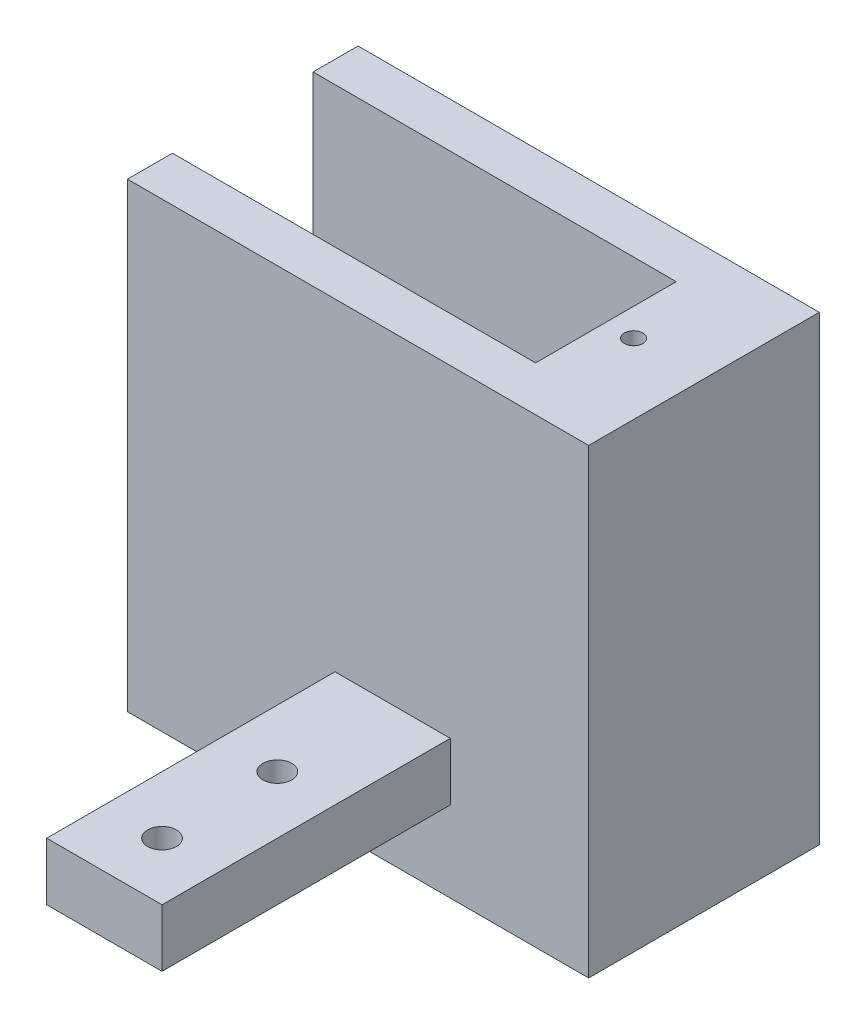
ISO-10303-21;
HEADER;
FILE_DESCRIPTION(('STEP AP214'),'2;1');
FILE_NAME('part.step','',(''),(''),'','','');
FILE_SCHEMA(('AUTOMOTIVE_DESIGN { 1 0 10303 214 1 1 1 1 }'));
ENDSEC;
DATA;
#1=APPLICATION_CONTEXT('core data for automotive mechanical design processes');
#2=APPLICATION_PROTOCOL_DEFINITION('international standard','automotive_design',2000,#1);
#3=PRODUCT_CONTEXT('',#1,'mechanical');
#4=PRODUCT('Part','Part','',(#3));
#5=PRODUCT_RELATED_PRODUCT_CATEGORY('part','',(#4));
#6=PRODUCT_DEFINITION_FORMATION('','',#4);
#7=PRODUCT_DEFINITION_CONTEXT('part definition',#1,'design');
#8=PRODUCT_DEFINITION('design','',#6,#7);
#9=PRODUCT_DEFINITION_SHAPE('','',#8);
#10=(LENGTH_UNIT() NAMED_UNIT(*) SI_UNIT(.MILLI.,.METRE.));
#11=(NAMED_UNIT(*) PLANE_ANGLE_UNIT() SI_UNIT($,.RADIAN.));
#12=(NAMED_UNIT(*) SI_UNIT($,.STERADIAN.) SOLID_ANGLE_UNIT());
#13=UNCERTAINTY_MEASURE_WITH_UNIT(LENGTH_MEASURE(1.E-05),#10,'distance_accuracy_value','');
#14=(GEOMETRIC_REPRESENTATION_CONTEXT(3) GLOBAL_UNCERTAINTY_ASSIGNED_CONTEXT((#13)) GLOBAL_UNIT_ASSIGNED_CONTEXT((#10,
#11,#12)) REPRESENTATION_CONTEXT('',''));
#15=CARTESIAN_POINT('',(0.,0.,0.));
#16=DIRECTION('',(0.,0.,1.));
#17=DIRECTION('',(1.,0.,0.));
#18=AXIS2_PLACEMENT_3D('',#15,#16,#17);
#19=CARTESIAN_POINT('',(0.,0.,10.));
#20=DIRECTION('',(0.,0.,1.));
#21=DIRECTION('',(1.,0.,0.));
#22=AXIS2_PLACEMENT_3D('',#19,#20,#21);
#23=PLANE('',#22);
#24=DIRECTION('',(0.,1.,0.));
#25=VECTOR('',#24,1.);
#26=CARTESIAN_POINT('',(20.,20.,10.));
#27=LINE('',#26,#25);
#28=CARTESIAN_POINT('',(20.,-20.,10.));
#29=VERTEX_POINT('',#28);
#30=CARTESIAN_POINT('',(20.,20.,10.));
#31=VERTEX_POINT('',#30);
#32=EDGE_CURVE('E206',#29,#31,#27,.T.);
#33=ORIENTED_EDGE('',*,*,#32,.T.);
#34=DIRECTION('',(-1.,0.,0.));
#35=VECTOR('',#34,1.);
#36=CARTESIAN_POINT('',(-20.,20.,10.));
#37=LINE('',#36,#35);
#38=CARTESIAN_POINT('',(-20.,20.,10.));
#39=VERTEX_POINT('',#38);
#40=EDGE_CURVE('E208',#31,#39,#37,.T.);
#41=ORIENTED_EDGE('',*,*,#40,.T.);
#42=DIRECTION('',(0.,-1.,0.));
#43=VECTOR('',#42,1.);
#44=CARTESIAN_POINT('',(-20.,20.,10.));
#45=LINE('',#44,#43);
#46=CARTESIAN_POINT('',(-20.,-20.,10.));
#47=VERTEX_POINT('',#46);
#48=EDGE_CURVE('E210',#39,#47,#45,.T.);
#49=ORIENTED_EDGE('',*,*,#48,.T.);
#50=DIRECTION('',(1.,0.,0.));
#51=VECTOR('',#50,1.);
#52=CARTESIAN_POINT('',(-20.,-20.,10.));
#53=LINE('',#52,#51);
#54=EDGE_CURVE('E63',#47,#29,#53,.T.);
#55=ORIENTED_EDGE('',*,*,#54,.T.);
#56=EDGE_LOOP('',(#33,#41,#49,#55));
#57=FACE_BOUND('',#56,.T.);
#58=DIRECTION('',(-1.,0.,0.));
#59=VECTOR('',#58,1.);
#60=CARTESIAN_POINT('',(7.99999999999999,-8.,10.));
#61=LINE('',#60,#59);
#62=CARTESIAN_POINT('',(7.99999999999999,-8.,10.));
#63=VERTEX_POINT('',#62);
#64=CARTESIAN_POINT('',(-2.00000000000001,-8.00000000000001,10.));
#65=VERTEX_POINT('',#64);
#66=EDGE_CURVE('E524',#63,#65,#61,.T.);
#67=ORIENTED_EDGE('',*,*,#66,.F.);
#68=DIRECTION('',(0.,1.,0.));
#69=VECTOR('',#68,1.);
#70=CARTESIAN_POINT('',(7.99999999999999,-13.,10.));
#71=LINE('',#70,#69);
#72=CARTESIAN_POINT('',(7.99999999999999,-13.,10.));
#73=VERTEX_POINT('',#72);
#74=EDGE_CURVE('E156',#73,#63,#71,.T.);
#75=ORIENTED_EDGE('',*,*,#74,.F.);
#76=DIRECTION('',(1.,0.,0.));
#77=VECTOR('',#76,1.);
#78=CARTESIAN_POINT('',(-2.00000000000001,-13.,10.));
#79=LINE('',#78,#77);
#80=CARTESIAN_POINT('',(-2.00000000000001,-13.,10.));
#81=VERTEX_POINT('',#80);
#82=EDGE_CURVE('E152',#81,#73,#79,.T.);
#83=ORIENTED_EDGE('',*,*,#82,.F.);
#84=DIRECTION('',(0.,-1.,0.));
#85=VECTOR('',#84,1.);
#86=CARTESIAN_POINT('',(-2.00000000000001,-8.00000000000001,10.));
#87=LINE('',#86,#85);
#88=EDGE_CURVE('E526',#65,#81,#87,.T.);
#89=ORIENTED_EDGE('',*,*,#88,.F.);
#90=EDGE_LOOP('',(#67,#75,#83,#89));
#91=FACE_BOUND('',#90,.T.);
#92=ADVANCED_FACE('F40',(#57,#91),#23,.T.);
#93=CARTESIAN_POINT('',(-20.,20.,10.));
#94=DIRECTION('',(0.,-1.,0.));
#95=DIRECTION('',(0.,0.,-1.));
#96=AXIS2_PLACEMENT_3D('',#93,#94,#95);
#97=PLANE('',#96);
#98=CARTESIAN_POINT('',(13.9,20.,0.));
#99=DIRECTION('',(0.,1.,0.));
#100=DIRECTION('',(0.,0.,1.));
#101=AXIS2_PLACEMENT_3D('',#98,#99,#100);
#102=CIRCLE('',#101,0.79999999999999);
#103=CARTESIAN_POINT('',(13.9,20.,0.79999999999999));
#104=VERTEX_POINT('',#103);
#105=EDGE_CURVE('E158',#104,#104,#102,.T.);
#106=ORIENTED_EDGE('',*,*,#105,.F.);
#107=EDGE_LOOP('',(#106));
#108=FACE_BOUND('',#107,.T.);
#109=DIRECTION('',(1.,0.,0.));
#110=VECTOR('',#109,1.);
#111=CARTESIAN_POINT('',(-38.5,20.,-6.1));
#112=LINE('',#111,#110);
#113=CARTESIAN_POINT('',(-20.,20.,-6.1));
#114=VERTEX_POINT('',#113);
#115=CARTESIAN_POINT('',(11.5,20.,-6.1));
#116=VERTEX_POINT('',#115);
#117=EDGE_CURVE('E174',#114,#116,#112,.T.);
#118=ORIENTED_EDGE('',*,*,#117,.T.);
#119=DIRECTION('',(0.,0.,-1.));
#120=VECTOR('',#119,1.);
#121=CARTESIAN_POINT('',(11.5,20.,6.1));
#122=LINE('',#121,#120);
#123=CARTESIAN_POINT('',(11.5,20.,6.1));
#124=VERTEX_POINT('',#123);
#125=EDGE_CURVE('E200',#124,#116,#122,.T.);
#126=ORIENTED_EDGE('',*,*,#125,.F.);
#127=DIRECTION('',(1.,0.,0.));
#128=VECTOR('',#127,1.);
#129=CARTESIAN_POINT('',(-38.5,20.,6.1));
#130=LINE('',#129,#128);
#131=CARTESIAN_POINT('',(-20.,20.,6.1));
#132=VERTEX_POINT('',#131);
#133=EDGE_CURVE('E192',#132,#124,#130,.T.);
#134=ORIENTED_EDGE('',*,*,#133,.F.);
#135=DIRECTION('',(0.,0.,-1.));
#136=VECTOR('',#135,1.);
#137=CARTESIAN_POINT('',(-20.,20.,10.));
#138=LINE('',#137,#136);
#139=EDGE_CURVE('E217',#39,#132,#138,.T.);
#140=ORIENTED_EDGE('',*,*,#139,.F.);
#141=ORIENTED_EDGE('',*,*,#40,.F.);
#142=DIRECTION('',(0.,0.,-1.));
#143=VECTOR('',#142,1.);
#144=CARTESIAN_POINT('',(20.,20.,10.));
#145=LINE('',#144,#143);
#146=CARTESIAN_POINT('',(20.,20.,-10.));
#147=VERTEX_POINT('',#146);
#148=EDGE_CURVE('E220',#31,#147,#145,.T.);
#149=ORIENTED_EDGE('',*,*,#148,.T.);
#150=DIRECTION('',(-1.,0.,0.));
#151=VECTOR('',#150,1.);
#152=CARTESIAN_POINT('',(-20.,20.,-10.));
#153=LINE('',#152,#151);
#154=CARTESIAN_POINT('',(-20.,20.,-10.));
#155=VERTEX_POINT('',#154);
#156=EDGE_CURVE('E186',#147,#155,#153,.T.);
#157=ORIENTED_EDGE('',*,*,#156,.T.);
#158=DIRECTION('',(0.,0.,1.));
#159=VECTOR('',#158,1.);
#160=CARTESIAN_POINT('',(-20.,20.,-10.));
#161=LINE('',#160,#159);
#162=EDGE_CURVE('E189',#155,#114,#161,.T.);
#163=ORIENTED_EDGE('',*,*,#162,.T.);
#164=EDGE_LOOP('',(#118,#126,#134,#140,#141,#149,#157,#163));
#165=FACE_BOUND('',#164,.T.);
#166=ADVANCED_FACE('F231',(#108,#165),#97,.F.);
#167=CARTESIAN_POINT('',(-20.,20.,10.));
#168=DIRECTION('',(1.,0.,0.));
#169=DIRECTION('',(0.,1.,0.));
#170=AXIS2_PLACEMENT_3D('',#167,#168,#169);
#171=PLANE('',#170);
#172=DIRECTION('',(0.,0.,-1.));
#173=VECTOR('',#172,1.);
#174=CARTESIAN_POINT('',(-20.,3.99999999999999,10.));
#175=LINE('',#174,#173);
#176=CARTESIAN_POINT('',(-20.,3.99999999999999,6.1));
#177=VERTEX_POINT('',#176);
#178=CARTESIAN_POINT('',(-20.,3.99999999999999,-6.1));
#179=VERTEX_POINT('',#178);
#180=EDGE_CURVE('E203',#177,#179,#175,.T.);
#181=ORIENTED_EDGE('',*,*,#180,.T.);
#182=DIRECTION('',(0.,-1.,0.));
#183=VECTOR('',#182,1.);
#184=CARTESIAN_POINT('',(-20.,20.,-6.1));
#185=LINE('',#184,#183);
#186=EDGE_CURVE('E11',#114,#179,#185,.T.);
#187=ORIENTED_EDGE('',*,*,#186,.F.);
#188=ORIENTED_EDGE('',*,*,#162,.F.);
#189=DIRECTION('',(0.,-1.,0.));
#190=VECTOR('',#189,1.);
#191=CARTESIAN_POINT('',(-20.,20.,-10.));
#192=LINE('',#191,#190);
#193=CARTESIAN_POINT('',(-20.,-20.,-10.));
#194=VERTEX_POINT('',#193);
#195=EDGE_CURVE('E183',#155,#194,#192,.T.);
#196=ORIENTED_EDGE('',*,*,#195,.T.);
#197=DIRECTION('',(0.,0.,-1.));
#198=VECTOR('',#197,1.);
#199=CARTESIAN_POINT('',(-20.,-20.,10.));
#200=LINE('',#199,#198);
#201=EDGE_CURVE('E215',#47,#194,#200,.T.);
#202=ORIENTED_EDGE('',*,*,#201,.F.);
#203=ORIENTED_EDGE('',*,*,#48,.F.);
#204=ORIENTED_EDGE('',*,*,#139,.T.);
#205=DIRECTION('',(0.,1.,0.));
#206=VECTOR('',#205,1.);
#207=CARTESIAN_POINT('',(-20.,20.,6.1));
#208=LINE('',#207,#206);
#209=EDGE_CURVE('E48',#177,#132,#208,.T.);
#210=ORIENTED_EDGE('',*,*,#209,.F.);
#211=EDGE_LOOP('',(#181,#187,#188,#196,#202,#203,#204,#210));
#212=FACE_BOUND('',#211,.T.);
#213=ADVANCED_FACE('F233',(#212),#171,.F.);
#214=CARTESIAN_POINT('',(20.,20.,10.));
#215=DIRECTION('',(-1.,0.,0.));
#216=DIRECTION('',(0.,-1.,0.));
#217=AXIS2_PLACEMENT_3D('',#214,#215,#216);
#218=PLANE('',#217);
#219=DIRECTION('',(0.,1.,0.));
#220=VECTOR('',#219,1.);
#221=CARTESIAN_POINT('',(20.,20.,-10.));
#222=LINE('',#221,#220);
#223=CARTESIAN_POINT('',(20.,-20.,-10.));
#224=VERTEX_POINT('',#223);
#225=EDGE_CURVE('E177',#224,#147,#222,.T.);
#226=ORIENTED_EDGE('',*,*,#225,.T.);
#227=ORIENTED_EDGE('',*,*,#148,.F.);
#228=ORIENTED_EDGE('',*,*,#32,.F.);
#229=DIRECTION('',(0.,0.,-1.));
#230=VECTOR('',#229,1.);
#231=CARTESIAN_POINT('',(20.,-20.,10.));
#232=LINE('',#231,#230);
#233=EDGE_CURVE('E213',#29,#224,#232,.T.);
#234=ORIENTED_EDGE('',*,*,#233,.T.);
#235=EDGE_LOOP('',(#226,#227,#228,#234));
#236=FACE_BOUND('',#235,.T.);
#237=ADVANCED_FACE('F42',(#236),#218,.F.);
#238=CARTESIAN_POINT('',(-20.,-20.,10.));
#239=DIRECTION('',(0.,1.,0.));
#240=DIRECTION('',(0.,0.,1.));
#241=AXIS2_PLACEMENT_3D('',#238,#239,#240);
#242=PLANE('',#241);
#243=DIRECTION('',(1.,0.,0.));
#244=VECTOR('',#243,1.);
#245=CARTESIAN_POINT('',(-20.,-20.,-10.));
#246=LINE('',#245,#244);
#247=EDGE_CURVE('E180',#194,#224,#246,.T.);
#248=ORIENTED_EDGE('',*,*,#247,.T.);
#249=ORIENTED_EDGE('',*,*,#233,.F.);
#250=ORIENTED_EDGE('',*,*,#54,.F.);
#251=ORIENTED_EDGE('',*,*,#201,.T.);
#252=EDGE_LOOP('',(#248,#249,#250,#251));
#253=FACE_BOUND('',#252,.T.);
#254=ADVANCED_FACE('F261',(#253),#242,.F.);
#255=CARTESIAN_POINT('',(0.,0.,6.1));
#256=DIRECTION('',(0.,0.,-1.));
#257=DIRECTION('',(-1.,0.,0.));
#258=AXIS2_PLACEMENT_3D('',#255,#256,#257);
#259=PLANE('',#258);
#260=ORIENTED_EDGE('',*,*,#209,.T.);
#261=ORIENTED_EDGE('',*,*,#133,.T.);
#262=DIRECTION('',(0.,-1.,0.));
#263=VECTOR('',#262,1.);
#264=CARTESIAN_POINT('',(11.5,20.,6.1));
#265=LINE('',#264,#263);
#266=CARTESIAN_POINT('',(11.5,4.,6.1));
#267=VERTEX_POINT('',#266);
#268=EDGE_CURVE('E194',#124,#267,#265,.T.);
#269=ORIENTED_EDGE('',*,*,#268,.T.);
#270=DIRECTION('',(-1.,0.,0.));
#271=VECTOR('',#270,1.);
#272=CARTESIAN_POINT('',(11.5,4.,6.1));
#273=LINE('',#272,#271);
#274=EDGE_CURVE('E197',#267,#177,#273,.T.);
#275=ORIENTED_EDGE('',*,*,#274,.T.);
#276=EDGE_LOOP('',(#260,#261,#269,#275));
#277=FACE_BOUND('',#276,.T.);
#278=ADVANCED_FACE('F224',(#277),#259,.T.);
#279=CARTESIAN_POINT('',(11.5,4.,6.1));
#280=DIRECTION('',(0.,-1.,0.));
#281=DIRECTION('',(1.,0.,0.));
#282=AXIS2_PLACEMENT_3D('',#279,#280,#281);
#283=PLANE('',#282);
#284=DIRECTION('',(0.,0.,-1.));
#285=VECTOR('',#284,1.);
#286=CARTESIAN_POINT('',(11.5,4.,6.1));
#287=LINE('',#286,#285);
#288=CARTESIAN_POINT('',(11.5,4.,-6.1));
#289=VERTEX_POINT('',#288);
#290=EDGE_CURVE('E201',#267,#289,#287,.T.);
#291=ORIENTED_EDGE('',*,*,#290,.T.);
#292=DIRECTION('',(-1.,0.,0.));
#293=VECTOR('',#292,1.);
#294=CARTESIAN_POINT('',(11.5,4.,-6.1));
#295=LINE('',#294,#293);
#296=EDGE_CURVE('E168',#289,#179,#295,.T.);
#297=ORIENTED_EDGE('',*,*,#296,.T.);
#298=ORIENTED_EDGE('',*,*,#180,.F.);
#299=ORIENTED_EDGE('',*,*,#274,.F.);
#300=EDGE_LOOP('',(#291,#297,#298,#299));
#301=FACE_BOUND('',#300,.T.);
#302=ADVANCED_FACE('F253',(#301),#283,.F.);
#303=CARTESIAN_POINT('',(11.5,20.,6.1));
#304=DIRECTION('',(1.,0.,0.));
#305=DIRECTION('',(0.,1.,0.));
#306=AXIS2_PLACEMENT_3D('',#303,#304,#305);
#307=PLANE('',#306);
#308=ORIENTED_EDGE('',*,*,#125,.T.);
#309=DIRECTION('',(0.,-1.,0.));
#310=VECTOR('',#309,1.);
#311=CARTESIAN_POINT('',(11.5,20.,-6.1));
#312=LINE('',#311,#310);
#313=EDGE_CURVE('E171',#116,#289,#312,.T.);
#314=ORIENTED_EDGE('',*,*,#313,.T.);
#315=ORIENTED_EDGE('',*,*,#290,.F.);
#316=ORIENTED_EDGE('',*,*,#268,.F.);
#317=EDGE_LOOP('',(#308,#314,#315,#316));
#318=FACE_BOUND('',#317,.T.);
#319=ADVANCED_FACE('F251',(#318),#307,.F.);
#320=CARTESIAN_POINT('',(0.,0.,-10.));
#321=DIRECTION('',(0.,0.,-1.));
#322=DIRECTION('',(1.,0.,0.));
#323=AXIS2_PLACEMENT_3D('',#320,#321,#322);
#324=PLANE('',#323);
#325=ORIENTED_EDGE('',*,*,#225,.F.);
#326=ORIENTED_EDGE('',*,*,#247,.F.);
#327=ORIENTED_EDGE('',*,*,#195,.F.);
#328=ORIENTED_EDGE('',*,*,#156,.F.);
#329=EDGE_LOOP('',(#325,#326,#327,#328));
#330=FACE_BOUND('',#329,.T.);
#331=ADVANCED_FACE('F244',(#330),#324,.T.);
#332=CARTESIAN_POINT('',(0.,0.,-6.1));
#333=DIRECTION('',(0.,0.,1.));
#334=DIRECTION('',(-1.,0.,0.));
#335=AXIS2_PLACEMENT_3D('',#332,#333,#334);
#336=PLANE('',#335);
#337=ORIENTED_EDGE('',*,*,#186,.T.);
#338=ORIENTED_EDGE('',*,*,#296,.F.);
#339=ORIENTED_EDGE('',*,*,#313,.F.);
#340=ORIENTED_EDGE('',*,*,#117,.F.);
#341=EDGE_LOOP('',(#337,#338,#339,#340));
#342=FACE_BOUND('',#341,.T.);
#343=ADVANCED_FACE('F248',(#342),#336,.T.);
#344=CARTESIAN_POINT('',(13.9,10.,0.));
#345=DIRECTION('',(0.,1.,0.));
#346=DIRECTION('',(0.,0.,1.));
#347=AXIS2_PLACEMENT_3D('',#344,#345,#346);
#348=CONICAL_SURFACE('',#347,0.799999999999997,1.02974425867665);
#349=CARTESIAN_POINT('',(13.9,9.51931150477795,0.));
#350=VERTEX_POINT('',#349);
#351=VERTEX_LOOP('',#350);
#352=FACE_BOUND('',#351,.T.);
#353=CARTESIAN_POINT('',(13.9,10.,0.));
#354=DIRECTION('',(0.,1.,0.));
#355=DIRECTION('',(0.,0.,1.));
#356=AXIS2_PLACEMENT_3D('',#353,#354,#355);
#357=CIRCLE('',#356,0.799999999999997);
#358=CARTESIAN_POINT('',(13.9,10.,0.799999999999997));
#359=VERTEX_POINT('',#358);
#360=EDGE_CURVE('E161',#359,#359,#357,.T.);
#361=ORIENTED_EDGE('',*,*,#360,.T.);
#362=EDGE_LOOP('',(#361));
#363=FACE_BOUND('',#362,.T.);
#364=ADVANCED_FACE('F322',(#352,#363),#348,.F.);
#365=CARTESIAN_POINT('',(13.9,20.,0.));
#366=DIRECTION('',(0.,1.,0.));
#367=DIRECTION('',(0.,0.,1.));
#368=AXIS2_PLACEMENT_3D('',#365,#366,#367);
#369=CYLINDRICAL_SURFACE('',#368,0.799999999999993);
#370=ORIENTED_EDGE('',*,*,#360,.F.);
#371=EDGE_LOOP('',(#370));
#372=FACE_BOUND('',#371,.T.);
#373=ORIENTED_EDGE('',*,*,#105,.T.);
#374=EDGE_LOOP('',(#373));
#375=FACE_BOUND('',#374,.T.);
#376=ADVANCED_FACE('F331',(#372,#375),#369,.F.);
#377=CARTESIAN_POINT('',(7.99999999999999,-13.,35.));
#378=DIRECTION('',(-1.,0.,0.));
#379=DIRECTION('',(0.,0.,1.));
#380=AXIS2_PLACEMENT_3D('',#377,#378,#379);
#381=PLANE('',#380);
#382=ORIENTED_EDGE('',*,*,#74,.T.);
#383=DIRECTION('',(0.,0.,-1.));
#384=VECTOR('',#383,1.);
#385=CARTESIAN_POINT('',(7.99999999999999,-8.,35.));
#386=LINE('',#385,#384);
#387=CARTESIAN_POINT('',(7.99999999999999,-8.,35.));
#388=VERTEX_POINT('',#387);
#389=EDGE_CURVE('E137',#388,#63,#386,.T.);
#390=ORIENTED_EDGE('',*,*,#389,.F.);
#391=DIRECTION('',(0.,1.,0.));
#392=VECTOR('',#391,1.);
#393=CARTESIAN_POINT('',(7.99999999999999,-13.,35.));
#394=LINE('',#393,#392);
#395=CARTESIAN_POINT('',(7.99999999999999,-13.,35.));
#396=VERTEX_POINT('',#395);
#397=EDGE_CURVE('E144',#396,#388,#394,.T.);
#398=ORIENTED_EDGE('',*,*,#397,.F.);
#399=DIRECTION('',(0.,0.,-1.));
#400=VECTOR('',#399,1.);
#401=CARTESIAN_POINT('',(7.99999999999999,-13.,35.));
#402=LINE('',#401,#400);
#403=EDGE_CURVE('E522',#396,#73,#402,.T.);
#404=ORIENTED_EDGE('',*,*,#403,.T.);
#405=EDGE_LOOP('',(#382,#390,#398,#404));
#406=FACE_BOUND('',#405,.T.);
#407=ADVANCED_FACE('F154',(#406),#381,.F.);
#408=CARTESIAN_POINT('',(7.99999999999999,-8.,35.));
#409=DIRECTION('',(0.,-1.,0.));
#410=DIRECTION('',(1.,0.,0.));
#411=AXIS2_PLACEMENT_3D('',#408,#409,#410);
#412=PLANE('',#411);
#413=CARTESIAN_POINT('',(2.99999999999999,-8.,20.));
#414=DIRECTION('',(0.,-1.,0.));
#415=DIRECTION('',(1.,0.,0.));
#416=AXIS2_PLACEMENT_3D('',#413,#414,#415);
#417=CIRCLE('',#416,1.24999999999999);
#418=CARTESIAN_POINT('',(4.24999999999998,-8.,20.));
#419=VERTEX_POINT('',#418);
#420=EDGE_CURVE('E510',#419,#419,#417,.T.);
#421=ORIENTED_EDGE('',*,*,#420,.T.);
#422=EDGE_LOOP('',(#421));
#423=FACE_BOUND('',#422,.T.);
#424=CARTESIAN_POINT('',(2.99999999999999,-8.,30.));
#425=DIRECTION('',(0.,-1.,0.));
#426=DIRECTION('',(1.,0.,0.));
#427=AXIS2_PLACEMENT_3D('',#424,#425,#426);
#428=CIRCLE('',#427,1.24999999999999);
#429=CARTESIAN_POINT('',(4.24999999999998,-8.,30.));
#430=VERTEX_POINT('',#429);
#431=EDGE_CURVE('E514',#430,#430,#428,.T.);
#432=ORIENTED_EDGE('',*,*,#431,.T.);
#433=EDGE_LOOP('',(#432));
#434=FACE_BOUND('',#433,.T.);
#435=ORIENTED_EDGE('',*,*,#66,.T.);
#436=DIRECTION('',(0.,0.,-1.));
#437=VECTOR('',#436,1.);
#438=CARTESIAN_POINT('',(-2.00000000000001,-8.00000000000001,35.));
#439=LINE('',#438,#437);
#440=CARTESIAN_POINT('',(-2.00000000000001,-8.00000000000001,35.));
#441=VERTEX_POINT('',#440);
#442=EDGE_CURVE('E140',#441,#65,#439,.T.);
#443=ORIENTED_EDGE('',*,*,#442,.F.);
#444=DIRECTION('',(-1.,0.,0.));
#445=VECTOR('',#444,1.);
#446=CARTESIAN_POINT('',(7.99999999999999,-8.,35.));
#447=LINE('',#446,#445);
#448=EDGE_CURVE('E133',#388,#441,#447,.T.);
#449=ORIENTED_EDGE('',*,*,#448,.F.);
#450=ORIENTED_EDGE('',*,*,#389,.T.);
#451=EDGE_LOOP('',(#435,#443,#449,#450));
#452=FACE_BOUND('',#451,.T.);
#453=ADVANCED_FACE('F135',(#423,#434,#452),#412,.F.);
#454=CARTESIAN_POINT('',(-2.00000000000001,-8.00000000000001,35.));
#455=DIRECTION('',(1.,0.,0.));
#456=DIRECTION('',(0.,1.,0.));
#457=AXIS2_PLACEMENT_3D('',#454,#455,#456);
#458=PLANE('',#457);
#459=ORIENTED_EDGE('',*,*,#88,.T.);
#460=DIRECTION('',(0.,0.,-1.));
#461=VECTOR('',#460,1.);
#462=CARTESIAN_POINT('',(-2.00000000000001,-13.,35.));
#463=LINE('',#462,#461);
#464=CARTESIAN_POINT('',(-2.00000000000001,-13.,35.));
#465=VERTEX_POINT('',#464);
#466=EDGE_CURVE('E55',#465,#81,#463,.T.);
#467=ORIENTED_EDGE('',*,*,#466,.F.);
#468=DIRECTION('',(0.,-1.,0.));
#469=VECTOR('',#468,1.);
#470=CARTESIAN_POINT('',(-2.00000000000001,-8.00000000000001,35.));
#471=LINE('',#470,#469);
#472=EDGE_CURVE('E143',#441,#465,#471,.T.);
#473=ORIENTED_EDGE('',*,*,#472,.F.);
#474=ORIENTED_EDGE('',*,*,#442,.T.);
#475=EDGE_LOOP('',(#459,#467,#473,#474));
#476=FACE_BOUND('',#475,.T.);
#477=ADVANCED_FACE('F363',(#476),#458,.F.);
#478=CARTESIAN_POINT('',(-2.00000000000001,-13.,35.));
#479=DIRECTION('',(0.,1.,0.));
#480=DIRECTION('',(0.,0.,1.));
#481=AXIS2_PLACEMENT_3D('',#478,#479,#480);
#482=PLANE('',#481);
#483=CARTESIAN_POINT('',(2.99999999999999,-13.,20.));
#484=DIRECTION('',(0.,-1.,0.));
#485=DIRECTION('',(0.,0.,-1.));
#486=AXIS2_PLACEMENT_3D('',#483,#484,#485);
#487=CIRCLE('',#486,1.24999999999999);
#488=CARTESIAN_POINT('',(2.99999999999999,-13.,18.75));
#489=VERTEX_POINT('',#488);
#490=EDGE_CURVE('E507',#489,#489,#487,.T.);
#491=ORIENTED_EDGE('',*,*,#490,.F.);
#492=EDGE_LOOP('',(#491));
#493=FACE_BOUND('',#492,.T.);
#494=CARTESIAN_POINT('',(2.99999999999999,-13.,30.));
#495=DIRECTION('',(0.,-1.,0.));
#496=DIRECTION('',(0.,0.,-1.));
#497=AXIS2_PLACEMENT_3D('',#494,#495,#496);
#498=CIRCLE('',#497,1.24999999999999);
#499=CARTESIAN_POINT('',(2.99999999999999,-13.,28.75));
#500=VERTEX_POINT('',#499);
#501=EDGE_CURVE('E511',#500,#500,#498,.T.);
#502=ORIENTED_EDGE('',*,*,#501,.F.);
#503=EDGE_LOOP('',(#502));
#504=FACE_BOUND('',#503,.T.);
#505=ORIENTED_EDGE('',*,*,#82,.T.);
#506=ORIENTED_EDGE('',*,*,#403,.F.);
#507=DIRECTION('',(1.,0.,0.));
#508=VECTOR('',#507,1.);
#509=CARTESIAN_POINT('',(-2.00000000000001,-13.,35.));
#510=LINE('',#509,#508);
#511=EDGE_CURVE('E148',#465,#396,#510,.T.);
#512=ORIENTED_EDGE('',*,*,#511,.F.);
#513=ORIENTED_EDGE('',*,*,#466,.T.);
#514=EDGE_LOOP('',(#505,#506,#512,#513));
#515=FACE_BOUND('',#514,.T.);
#516=ADVANCED_FACE('F373',(#493,#504,#515),#482,.F.);
#517=CARTESIAN_POINT('',(0.,0.,35.));
#518=DIRECTION('',(0.,0.,1.));
#519=DIRECTION('',(1.,0.,0.));
#520=AXIS2_PLACEMENT_3D('',#517,#518,#519);
#521=PLANE('',#520);
#522=ORIENTED_EDGE('',*,*,#397,.T.);
#523=ORIENTED_EDGE('',*,*,#448,.T.);
#524=ORIENTED_EDGE('',*,*,#472,.T.);
#525=ORIENTED_EDGE('',*,*,#511,.T.);
#526=EDGE_LOOP('',(#522,#523,#524,#525));
#527=FACE_BOUND('',#526,.T.);
#528=ADVANCED_FACE('F147',(#527),#521,.T.);
#529=CARTESIAN_POINT('',(2.99999999999999,-13.,30.));
#530=DIRECTION('',(0.,-1.,0.));
#531=DIRECTION('',(0.,0.,-1.));
#532=AXIS2_PLACEMENT_3D('',#529,#530,#531);
#533=CYLINDRICAL_SURFACE('',#532,1.24999999999999);
#534=ORIENTED_EDGE('',*,*,#501,.T.);
#535=EDGE_LOOP('',(#534));
#536=FACE_BOUND('',#535,.T.);
#537=ORIENTED_EDGE('',*,*,#431,.F.);
#538=EDGE_LOOP('',(#537));
#539=FACE_BOUND('',#538,.T.);
#540=ADVANCED_FACE('F392',(#536,#539),#533,.F.);
#541=CARTESIAN_POINT('',(2.99999999999999,-13.,20.));
#542=DIRECTION('',(0.,-1.,0.));
#543=DIRECTION('',(0.,0.,-1.));
#544=AXIS2_PLACEMENT_3D('',#541,#542,#543);
#545=CYLINDRICAL_SURFACE('',#544,1.24999999999999);
#546=ORIENTED_EDGE('',*,*,#490,.T.);
#547=EDGE_LOOP('',(#546));
#548=FACE_BOUND('',#547,.T.);
#549=ORIENTED_EDGE('',*,*,#420,.F.);
#550=EDGE_LOOP('',(#549));
#551=FACE_BOUND('',#550,.T.);
#552=ADVANCED_FACE('F401',(#548,#551),#545,.F.);
#553=CLOSED_SHELL('',(#92,#166,#213,#237,#254,#278,#302,#319,#331,#343,#364,#376,#407,#453,#477,
#516,#528,#540,#552));
#554=MANIFOLD_SOLID_BREP('B2',#553);
#555=ADVANCED_BREP_SHAPE_REPRESENTATION('',(#18,#554),#14);
#556=SHAPE_DEFINITION_REPRESENTATION(#9,#555);
ENDSEC;
END-ISO-10303-21;
